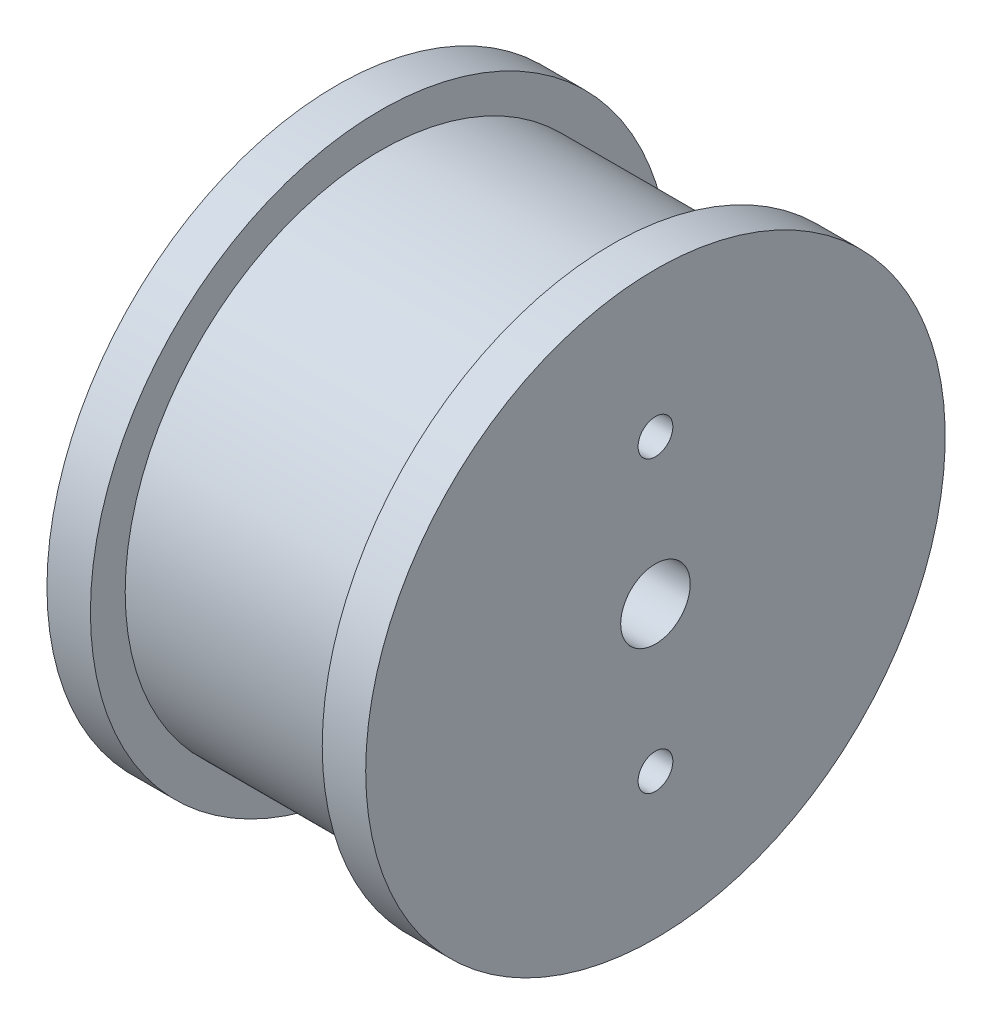
ISO-10303-21;
HEADER;
FILE_DESCRIPTION(('STEP AP214'),'2;1');
FILE_NAME('part.step','',(''),(''),'','','');
FILE_SCHEMA(('AUTOMOTIVE_DESIGN { 1 0 10303 214 1 1 1 1 }'));
ENDSEC;
DATA;
#1=APPLICATION_CONTEXT('core data for automotive mechanical design processes');
#2=APPLICATION_PROTOCOL_DEFINITION('international standard','automotive_design',2000,#1);
#3=PRODUCT_CONTEXT('',#1,'mechanical');
#4=PRODUCT('Part','Part','',(#3));
#5=PRODUCT_RELATED_PRODUCT_CATEGORY('part','',(#4));
#6=PRODUCT_DEFINITION_FORMATION('','',#4);
#7=PRODUCT_DEFINITION_CONTEXT('part definition',#1,'design');
#8=PRODUCT_DEFINITION('design','',#6,#7);
#9=PRODUCT_DEFINITION_SHAPE('','',#8);
#10=(LENGTH_UNIT() NAMED_UNIT(*) SI_UNIT(.MILLI.,.METRE.));
#11=(NAMED_UNIT(*) PLANE_ANGLE_UNIT() SI_UNIT($,.RADIAN.));
#12=(NAMED_UNIT(*) SI_UNIT($,.STERADIAN.) SOLID_ANGLE_UNIT());
#13=UNCERTAINTY_MEASURE_WITH_UNIT(LENGTH_MEASURE(1.E-05),#10,'distance_accuracy_value','');
#14=(GEOMETRIC_REPRESENTATION_CONTEXT(3) GLOBAL_UNCERTAINTY_ASSIGNED_CONTEXT((#13)) GLOBAL_UNIT_ASSIGNED_CONTEXT((#10,
#11,#12)) REPRESENTATION_CONTEXT('',''));
#15=CARTESIAN_POINT('',(0.,0.,0.));
#16=DIRECTION('',(0.,0.,1.));
#17=DIRECTION('',(1.,0.,0.));
#18=AXIS2_PLACEMENT_3D('',#15,#16,#17);
#19=CARTESIAN_POINT('',(20.,44.,0.));
#20=DIRECTION('',(1.,0.,0.));
#21=DIRECTION('',(0.,0.,-1.));
#22=AXIS2_PLACEMENT_3D('',#19,#20,#21);
#23=PLANE('',#22);
#24=CARTESIAN_POINT('',(20.,0.,0.));
#25=DIRECTION('',(-1.,0.,0.));
#26=DIRECTION('',(0.,0.,1.));
#27=AXIS2_PLACEMENT_3D('',#24,#25,#26);
#28=CIRCLE('',#27,44.);
#29=CARTESIAN_POINT('',(20.,0.,44.));
#30=VERTEX_POINT('',#29);
#31=EDGE_CURVE('E73',#30,#30,#28,.T.);
#32=ORIENTED_EDGE('',*,*,#31,.F.);
#33=EDGE_LOOP('',(#32));
#34=FACE_BOUND('',#33,.T.);
#35=CARTESIAN_POINT('',(20.,0.,0.));
#36=DIRECTION('',(-1.,0.,0.));
#37=DIRECTION('',(0.,0.,1.));
#38=AXIS2_PLACEMENT_3D('',#35,#36,#37);
#39=CIRCLE('',#38,50.);
#40=CARTESIAN_POINT('',(20.,0.,50.));
#41=VERTEX_POINT('',#40);
#42=EDGE_CURVE('E10',#41,#41,#39,.T.);
#43=ORIENTED_EDGE('',*,*,#42,.T.);
#44=EDGE_LOOP('',(#43));
#45=FACE_BOUND('',#44,.T.);
#46=ADVANCED_FACE('F38',(#34,#45),#23,.F.);
#47=CARTESIAN_POINT('',(-137.236084452975,0.,0.));
#48=DIRECTION('',(-1.,0.,0.));
#49=DIRECTION('',(0.,0.,1.));
#50=AXIS2_PLACEMENT_3D('',#47,#48,#49);
#51=CYLINDRICAL_SURFACE('',#50,50.);
#52=ORIENTED_EDGE('',*,*,#42,.F.);
#53=EDGE_LOOP('',(#52));
#54=FACE_BOUND('',#53,.T.);
#55=CARTESIAN_POINT('',(27.5,0.,0.));
#56=DIRECTION('',(-1.,0.,0.));
#57=DIRECTION('',(0.,0.,1.));
#58=AXIS2_PLACEMENT_3D('',#55,#56,#57);
#59=CIRCLE('',#58,50.);
#60=CARTESIAN_POINT('',(27.5,0.,50.));
#61=VERTEX_POINT('',#60);
#62=EDGE_CURVE('E45',#61,#61,#59,.T.);
#63=ORIENTED_EDGE('',*,*,#62,.T.);
#64=EDGE_LOOP('',(#63));
#65=FACE_BOUND('',#64,.T.);
#66=ADVANCED_FACE('F108',(#54,#65),#51,.T.);
#67=CARTESIAN_POINT('',(27.5,50.,0.));
#68=DIRECTION('',(-1.,0.,0.));
#69=DIRECTION('',(0.,0.,1.));
#70=AXIS2_PLACEMENT_3D('',#67,#68,#69);
#71=PLANE('',#70);
#72=CARTESIAN_POINT('',(27.5,25.,0.));
#73=DIRECTION('',(1.,0.,0.));
#74=DIRECTION('',(0.,0.,-1.));
#75=AXIS2_PLACEMENT_3D('',#72,#73,#74);
#76=CIRCLE('',#75,3.);
#77=CARTESIAN_POINT('',(27.5,25.,-3.));
#78=VERTEX_POINT('',#77);
#79=EDGE_CURVE('E86',#78,#78,#76,.T.);
#80=ORIENTED_EDGE('',*,*,#79,.F.);
#81=EDGE_LOOP('',(#80));
#82=FACE_BOUND('',#81,.T.);
#83=CARTESIAN_POINT('',(27.5,-25.,0.));
#84=DIRECTION('',(1.,0.,0.));
#85=DIRECTION('',(0.,0.,-1.));
#86=AXIS2_PLACEMENT_3D('',#83,#84,#85);
#87=CIRCLE('',#86,3.);
#88=CARTESIAN_POINT('',(27.5,-25.,-3.));
#89=VERTEX_POINT('',#88);
#90=EDGE_CURVE('E78',#89,#89,#87,.T.);
#91=ORIENTED_EDGE('',*,*,#90,.F.);
#92=EDGE_LOOP('',(#91));
#93=FACE_BOUND('',#92,.T.);
#94=ORIENTED_EDGE('',*,*,#62,.F.);
#95=EDGE_LOOP('',(#94));
#96=FACE_BOUND('',#95,.T.);
#97=CARTESIAN_POINT('',(27.5,0.,0.));
#98=DIRECTION('',(-1.,0.,0.));
#99=DIRECTION('',(0.,0.,1.));
#100=AXIS2_PLACEMENT_3D('',#97,#98,#99);
#101=CIRCLE('',#100,6.);
#102=CARTESIAN_POINT('',(27.5,0.,6.));
#103=VERTEX_POINT('',#102);
#104=EDGE_CURVE('E50',#103,#103,#101,.T.);
#105=ORIENTED_EDGE('',*,*,#104,.T.);
#106=EDGE_LOOP('',(#105));
#107=FACE_BOUND('',#106,.T.);
#108=ADVANCED_FACE('F104',(#82,#93,#96,#107),#71,.F.);
#109=CARTESIAN_POINT('',(-137.236084452975,0.,0.));
#110=DIRECTION('',(-1.,0.,0.));
#111=DIRECTION('',(0.,0.,1.));
#112=AXIS2_PLACEMENT_3D('',#109,#110,#111);
#113=CYLINDRICAL_SURFACE('',#112,5.99999999999999);
#114=ORIENTED_EDGE('',*,*,#104,.F.);
#115=EDGE_LOOP('',(#114));
#116=FACE_BOUND('',#115,.T.);
#117=CARTESIAN_POINT('',(-27.5,0.,0.));
#118=DIRECTION('',(-1.,0.,0.));
#119=DIRECTION('',(0.,0.,1.));
#120=AXIS2_PLACEMENT_3D('',#117,#118,#119);
#121=CIRCLE('',#120,5.99999999999999);
#122=CARTESIAN_POINT('',(-27.5,0.,5.99999999999999));
#123=VERTEX_POINT('',#122);
#124=EDGE_CURVE('E55',#123,#123,#121,.T.);
#125=ORIENTED_EDGE('',*,*,#124,.T.);
#126=EDGE_LOOP('',(#125));
#127=FACE_BOUND('',#126,.T.);
#128=ADVANCED_FACE('F107',(#116,#127),#113,.F.);
#129=CARTESIAN_POINT('',(-27.5,5.99999999999999,0.));
#130=DIRECTION('',(1.,0.,0.));
#131=DIRECTION('',(0.,0.,-1.));
#132=AXIS2_PLACEMENT_3D('',#129,#130,#131);
#133=PLANE('',#132);
#134=CARTESIAN_POINT('',(-27.5,25.,0.));
#135=DIRECTION('',(1.,0.,0.));
#136=DIRECTION('',(0.,0.,-1.));
#137=AXIS2_PLACEMENT_3D('',#134,#135,#136);
#138=CIRCLE('',#137,3.);
#139=CARTESIAN_POINT('',(-27.5,25.,-3.));
#140=VERTEX_POINT('',#139);
#141=EDGE_CURVE('E77',#140,#140,#138,.T.);
#142=ORIENTED_EDGE('',*,*,#141,.T.);
#143=EDGE_LOOP('',(#142));
#144=FACE_BOUND('',#143,.T.);
#145=CARTESIAN_POINT('',(-27.5,-25.,0.));
#146=DIRECTION('',(1.,0.,0.));
#147=DIRECTION('',(0.,0.,-1.));
#148=AXIS2_PLACEMENT_3D('',#145,#146,#147);
#149=CIRCLE('',#148,3.);
#150=CARTESIAN_POINT('',(-27.5,-25.,-3.));
#151=VERTEX_POINT('',#150);
#152=EDGE_CURVE('E82',#151,#151,#149,.T.);
#153=ORIENTED_EDGE('',*,*,#152,.T.);
#154=EDGE_LOOP('',(#153));
#155=FACE_BOUND('',#154,.T.);
#156=ORIENTED_EDGE('',*,*,#124,.F.);
#157=EDGE_LOOP('',(#156));
#158=FACE_BOUND('',#157,.T.);
#159=CARTESIAN_POINT('',(-27.5,0.,0.));
#160=DIRECTION('',(-1.,0.,0.));
#161=DIRECTION('',(0.,0.,1.));
#162=AXIS2_PLACEMENT_3D('',#159,#160,#161);
#163=CIRCLE('',#162,50.);
#164=CARTESIAN_POINT('',(-27.5,0.,50.));
#165=VERTEX_POINT('',#164);
#166=EDGE_CURVE('E61',#165,#165,#163,.T.);
#167=ORIENTED_EDGE('',*,*,#166,.T.);
#168=EDGE_LOOP('',(#167));
#169=FACE_BOUND('',#168,.T.);
#170=ADVANCED_FACE('F94',(#144,#155,#158,#169),#133,.F.);
#171=CARTESIAN_POINT('',(-137.236084452975,0.,0.));
#172=DIRECTION('',(-1.,0.,0.));
#173=DIRECTION('',(0.,0.,1.));
#174=AXIS2_PLACEMENT_3D('',#171,#172,#173);
#175=CYLINDRICAL_SURFACE('',#174,50.);
#176=ORIENTED_EDGE('',*,*,#166,.F.);
#177=EDGE_LOOP('',(#176));
#178=FACE_BOUND('',#177,.T.);
#179=CARTESIAN_POINT('',(-20.,0.,0.));
#180=DIRECTION('',(-1.,0.,0.));
#181=DIRECTION('',(0.,0.,1.));
#182=AXIS2_PLACEMENT_3D('',#179,#180,#181);
#183=CIRCLE('',#182,50.);
#184=CARTESIAN_POINT('',(-20.,0.,50.));
#185=VERTEX_POINT('',#184);
#186=EDGE_CURVE('E65',#185,#185,#183,.T.);
#187=ORIENTED_EDGE('',*,*,#186,.T.);
#188=EDGE_LOOP('',(#187));
#189=FACE_BOUND('',#188,.T.);
#190=ADVANCED_FACE('F122',(#178,#189),#175,.T.);
#191=CARTESIAN_POINT('',(-20.,50.,0.));
#192=DIRECTION('',(-1.,0.,0.));
#193=DIRECTION('',(0.,0.,1.));
#194=AXIS2_PLACEMENT_3D('',#191,#192,#193);
#195=PLANE('',#194);
#196=ORIENTED_EDGE('',*,*,#186,.F.);
#197=EDGE_LOOP('',(#196));
#198=FACE_BOUND('',#197,.T.);
#199=CARTESIAN_POINT('',(-20.,0.,0.));
#200=DIRECTION('',(-1.,0.,0.));
#201=DIRECTION('',(0.,0.,1.));
#202=AXIS2_PLACEMENT_3D('',#199,#200,#201);
#203=CIRCLE('',#202,44.);
#204=CARTESIAN_POINT('',(-20.,0.,44.));
#205=VERTEX_POINT('',#204);
#206=EDGE_CURVE('E69',#205,#205,#203,.T.);
#207=ORIENTED_EDGE('',*,*,#206,.T.);
#208=EDGE_LOOP('',(#207));
#209=FACE_BOUND('',#208,.T.);
#210=ADVANCED_FACE('F128',(#198,#209),#195,.F.);
#211=CARTESIAN_POINT('',(-137.236084452975,0.,0.));
#212=DIRECTION('',(-1.,0.,0.));
#213=DIRECTION('',(0.,0.,1.));
#214=AXIS2_PLACEMENT_3D('',#211,#212,#213);
#215=CYLINDRICAL_SURFACE('',#214,44.);
#216=ORIENTED_EDGE('',*,*,#206,.F.);
#217=EDGE_LOOP('',(#216));
#218=FACE_BOUND('',#217,.T.);
#219=ORIENTED_EDGE('',*,*,#31,.T.);
#220=EDGE_LOOP('',(#219));
#221=FACE_BOUND('',#220,.T.);
#222=ADVANCED_FACE('F134',(#218,#221),#215,.T.);
#223=CARTESIAN_POINT('',(-27.5,-25.,0.));
#224=DIRECTION('',(1.,0.,0.));
#225=DIRECTION('',(0.,0.,-1.));
#226=AXIS2_PLACEMENT_3D('',#223,#224,#225);
#227=CYLINDRICAL_SURFACE('',#226,3.);
#228=ORIENTED_EDGE('',*,*,#152,.F.);
#229=EDGE_LOOP('',(#228));
#230=FACE_BOUND('',#229,.T.);
#231=ORIENTED_EDGE('',*,*,#90,.T.);
#232=EDGE_LOOP('',(#231));
#233=FACE_BOUND('',#232,.T.);
#234=ADVANCED_FACE('F100',(#230,#233),#227,.F.);
#235=CARTESIAN_POINT('',(-27.5,25.,0.));
#236=DIRECTION('',(1.,0.,0.));
#237=DIRECTION('',(0.,0.,-1.));
#238=AXIS2_PLACEMENT_3D('',#235,#236,#237);
#239=CYLINDRICAL_SURFACE('',#238,3.);
#240=ORIENTED_EDGE('',*,*,#141,.F.);
#241=EDGE_LOOP('',(#240));
#242=FACE_BOUND('',#241,.T.);
#243=ORIENTED_EDGE('',*,*,#79,.T.);
#244=EDGE_LOOP('',(#243));
#245=FACE_BOUND('',#244,.T.);
#246=ADVANCED_FACE('F97',(#242,#245),#239,.F.);
#247=CLOSED_SHELL('',(#46,#66,#108,#128,#170,#190,#210,#222,#234,#246));
#248=MANIFOLD_SOLID_BREP('B2',#247);
#249=ADVANCED_BREP_SHAPE_REPRESENTATION('',(#18,#248),#14);
#250=SHAPE_DEFINITION_REPRESENTATION(#9,#249);
ENDSEC;
END-ISO-10303-21;
